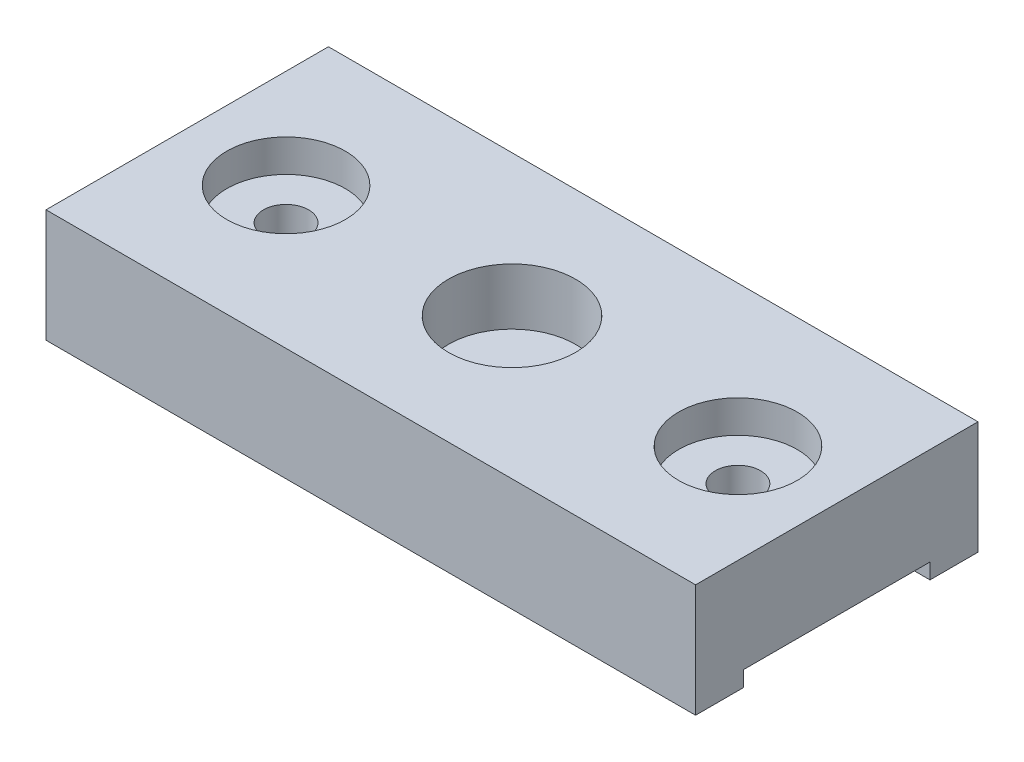
ISO-10303-21;
HEADER;
FILE_DESCRIPTION(('STEP AP214'),'2;1');
FILE_NAME('part.step','',(''),(''),'','','');
FILE_SCHEMA(('AUTOMOTIVE_DESIGN { 1 0 10303 214 1 1 1 1 }'));
ENDSEC;
DATA;
#1=APPLICATION_CONTEXT('core data for automotive mechanical design processes');
#2=APPLICATION_PROTOCOL_DEFINITION('international standard','automotive_design',2000,#1);
#3=PRODUCT_CONTEXT('',#1,'mechanical');
#4=PRODUCT('Part','Part','',(#3));
#5=PRODUCT_RELATED_PRODUCT_CATEGORY('part','',(#4));
#6=PRODUCT_DEFINITION_FORMATION('','',#4);
#7=PRODUCT_DEFINITION_CONTEXT('part definition',#1,'design');
#8=PRODUCT_DEFINITION('design','',#6,#7);
#9=PRODUCT_DEFINITION_SHAPE('','',#8);
#10=(LENGTH_UNIT() NAMED_UNIT(*) SI_UNIT(.MILLI.,.METRE.));
#11=(NAMED_UNIT(*) PLANE_ANGLE_UNIT() SI_UNIT($,.RADIAN.));
#12=(NAMED_UNIT(*) SI_UNIT($,.STERADIAN.) SOLID_ANGLE_UNIT());
#13=UNCERTAINTY_MEASURE_WITH_UNIT(LENGTH_MEASURE(1.E-05),#10,'distance_accuracy_value','');
#14=(GEOMETRIC_REPRESENTATION_CONTEXT(3) GLOBAL_UNCERTAINTY_ASSIGNED_CONTEXT((#13)) GLOBAL_UNIT_ASSIGNED_CONTEXT((#10,
#11,#12)) REPRESENTATION_CONTEXT('',''));
#15=CARTESIAN_POINT('',(0.,0.,0.));
#16=DIRECTION('',(0.,0.,1.));
#17=DIRECTION('',(1.,0.,0.));
#18=AXIS2_PLACEMENT_3D('',#15,#16,#17);
#19=CARTESIAN_POINT('',(0.,0.,0.));
#20=DIRECTION('',(0.,1.,0.));
#21=DIRECTION('',(0.,0.,1.));
#22=AXIS2_PLACEMENT_3D('',#19,#20,#21);
#23=PLANE('',#22);
#24=DIRECTION('',(0.,0.,-1.));
#25=VECTOR('',#24,1.);
#26=CARTESIAN_POINT('',(23.,0.,0.));
#27=LINE('',#26,#25);
#28=CARTESIAN_POINT('',(23.,0.,-6.6));
#29=VERTEX_POINT('',#28);
#30=CARTESIAN_POINT('',(23.,0.,-10.));
#31=VERTEX_POINT('',#30);
#32=EDGE_CURVE('E79',#29,#31,#27,.T.);
#33=ORIENTED_EDGE('',*,*,#32,.F.);
#34=DIRECTION('',(-1.,0.,0.));
#35=VECTOR('',#34,1.);
#36=CARTESIAN_POINT('',(23.001,0.,-6.6));
#37=LINE('',#36,#35);
#38=CARTESIAN_POINT('',(-23.,0.,-6.6));
#39=VERTEX_POINT('',#38);
#40=EDGE_CURVE('E163',#29,#39,#37,.T.);
#41=ORIENTED_EDGE('',*,*,#40,.T.);
#42=DIRECTION('',(0.,0.,-1.));
#43=VECTOR('',#42,1.);
#44=CARTESIAN_POINT('',(-23.,0.,0.));
#45=LINE('',#44,#43);
#46=CARTESIAN_POINT('',(-23.,0.,-10.));
#47=VERTEX_POINT('',#46);
#48=EDGE_CURVE('E130',#39,#47,#45,.T.);
#49=ORIENTED_EDGE('',*,*,#48,.T.);
#50=DIRECTION('',(1.,0.,0.));
#51=VECTOR('',#50,1.);
#52=CARTESIAN_POINT('',(0.,0.,-10.));
#53=LINE('',#52,#51);
#54=EDGE_CURVE('E133',#47,#31,#53,.T.);
#55=ORIENTED_EDGE('',*,*,#54,.T.);
#56=EDGE_LOOP('',(#33,#41,#49,#55));
#57=FACE_BOUND('',#56,.T.);
#58=ADVANCED_FACE('F34',(#57),#23,.F.);
#59=CARTESIAN_POINT('',(0.,8.,-10.));
#60=DIRECTION('',(0.,0.,-1.));
#61=DIRECTION('',(-1.,0.,0.));
#62=AXIS2_PLACEMENT_3D('',#59,#60,#61);
#63=PLANE('',#62);
#64=ORIENTED_EDGE('',*,*,#54,.F.);
#65=DIRECTION('',(0.,-1.,0.));
#66=VECTOR('',#65,1.);
#67=CARTESIAN_POINT('',(-23.,8.,-10.));
#68=LINE('',#67,#66);
#69=CARTESIAN_POINT('',(-23.,8.,-10.));
#70=VERTEX_POINT('',#69);
#71=EDGE_CURVE('E11',#70,#47,#68,.T.);
#72=ORIENTED_EDGE('',*,*,#71,.F.);
#73=DIRECTION('',(1.,0.,0.));
#74=VECTOR('',#73,1.);
#75=CARTESIAN_POINT('',(0.,8.,-10.));
#76=LINE('',#75,#74);
#77=CARTESIAN_POINT('',(23.,8.,-10.));
#78=VERTEX_POINT('',#77);
#79=EDGE_CURVE('E139',#70,#78,#76,.T.);
#80=ORIENTED_EDGE('',*,*,#79,.T.);
#81=DIRECTION('',(0.,-1.,0.));
#82=VECTOR('',#81,1.);
#83=CARTESIAN_POINT('',(23.,8.,-10.));
#84=LINE('',#83,#82);
#85=EDGE_CURVE('E140',#78,#31,#84,.T.);
#86=ORIENTED_EDGE('',*,*,#85,.T.);
#87=EDGE_LOOP('',(#64,#72,#80,#86));
#88=FACE_BOUND('',#87,.T.);
#89=ADVANCED_FACE('F36',(#88),#63,.T.);
#90=CARTESIAN_POINT('',(-23.,8.,0.));
#91=DIRECTION('',(-1.,0.,0.));
#92=DIRECTION('',(0.,0.,1.));
#93=AXIS2_PLACEMENT_3D('',#90,#91,#92);
#94=PLANE('',#93);
#95=DIRECTION('',(0.,-1.,0.));
#96=VECTOR('',#95,1.);
#97=CARTESIAN_POINT('',(-23.,0.,-6.6));
#98=LINE('',#97,#96);
#99=CARTESIAN_POINT('',(-23.,1.1,-6.6));
#100=VERTEX_POINT('',#99);
#101=EDGE_CURVE('E116',#100,#39,#98,.T.);
#102=ORIENTED_EDGE('',*,*,#101,.F.);
#103=DIRECTION('',(0.,0.,-1.));
#104=VECTOR('',#103,1.);
#105=CARTESIAN_POINT('',(-23.,1.1,-6.6));
#106=LINE('',#105,#104);
#107=CARTESIAN_POINT('',(-23.,1.1,6.6));
#108=VERTEX_POINT('',#107);
#109=EDGE_CURVE('E124',#108,#100,#106,.T.);
#110=ORIENTED_EDGE('',*,*,#109,.F.);
#111=DIRECTION('',(0.,1.,0.));
#112=VECTOR('',#111,1.);
#113=CARTESIAN_POINT('',(-23.,1.1,6.6));
#114=LINE('',#113,#112);
#115=CARTESIAN_POINT('',(-23.,0.,6.6));
#116=VERTEX_POINT('',#115);
#117=EDGE_CURVE('E109',#116,#108,#114,.T.);
#118=ORIENTED_EDGE('',*,*,#117,.F.);
#119=CARTESIAN_POINT('',(-23.,0.,10.));
#120=VERTEX_POINT('',#119);
#121=EDGE_CURVE('E122',#120,#116,#45,.T.);
#122=ORIENTED_EDGE('',*,*,#121,.F.);
#123=DIRECTION('',(0.,-1.,0.));
#124=VECTOR('',#123,1.);
#125=CARTESIAN_POINT('',(-23.,8.,10.));
#126=LINE('',#125,#124);
#127=CARTESIAN_POINT('',(-23.,8.,10.));
#128=VERTEX_POINT('',#127);
#129=EDGE_CURVE('E42',#128,#120,#126,.T.);
#130=ORIENTED_EDGE('',*,*,#129,.F.);
#131=DIRECTION('',(0.,0.,-1.));
#132=VECTOR('',#131,1.);
#133=CARTESIAN_POINT('',(-23.,8.,0.));
#134=LINE('',#133,#132);
#135=EDGE_CURVE('E151',#128,#70,#134,.T.);
#136=ORIENTED_EDGE('',*,*,#135,.T.);
#137=ORIENTED_EDGE('',*,*,#71,.T.);
#138=ORIENTED_EDGE('',*,*,#48,.F.);
#139=EDGE_LOOP('',(#102,#110,#118,#122,#130,#136,#137,#138));
#140=FACE_BOUND('',#139,.T.);
#141=ADVANCED_FACE('F121',(#140),#94,.T.);
#142=CARTESIAN_POINT('',(0.,8.,10.));
#143=DIRECTION('',(0.,0.,-1.));
#144=DIRECTION('',(-1.,0.,0.));
#145=AXIS2_PLACEMENT_3D('',#142,#143,#144);
#146=PLANE('',#145);
#147=DIRECTION('',(1.,0.,0.));
#148=VECTOR('',#147,1.);
#149=CARTESIAN_POINT('',(0.,0.,10.));
#150=LINE('',#149,#148);
#151=CARTESIAN_POINT('',(23.,0.,10.));
#152=VERTEX_POINT('',#151);
#153=EDGE_CURVE('E129',#120,#152,#150,.T.);
#154=ORIENTED_EDGE('',*,*,#153,.T.);
#155=DIRECTION('',(0.,-1.,0.));
#156=VECTOR('',#155,1.);
#157=CARTESIAN_POINT('',(23.,8.,10.));
#158=LINE('',#157,#156);
#159=CARTESIAN_POINT('',(23.,8.,10.));
#160=VERTEX_POINT('',#159);
#161=EDGE_CURVE('E142',#160,#152,#158,.T.);
#162=ORIENTED_EDGE('',*,*,#161,.F.);
#163=DIRECTION('',(1.,0.,0.));
#164=VECTOR('',#163,1.);
#165=CARTESIAN_POINT('',(0.,8.,10.));
#166=LINE('',#165,#164);
#167=EDGE_CURVE('E148',#128,#160,#166,.T.);
#168=ORIENTED_EDGE('',*,*,#167,.F.);
#169=ORIENTED_EDGE('',*,*,#129,.T.);
#170=EDGE_LOOP('',(#154,#162,#168,#169));
#171=FACE_BOUND('',#170,.T.);
#172=ADVANCED_FACE('F146',(#171),#146,.F.);
#173=CARTESIAN_POINT('',(23.,8.,0.));
#174=DIRECTION('',(-1.,0.,0.));
#175=DIRECTION('',(0.,0.,1.));
#176=AXIS2_PLACEMENT_3D('',#173,#174,#175);
#177=PLANE('',#176);
#178=DIRECTION('',(0.,0.,1.));
#179=VECTOR('',#178,1.);
#180=CARTESIAN_POINT('',(23.,1.1,-6.6));
#181=LINE('',#180,#179);
#182=CARTESIAN_POINT('',(23.,1.1,-6.6));
#183=VERTEX_POINT('',#182);
#184=CARTESIAN_POINT('',(23.,1.1,6.6));
#185=VERTEX_POINT('',#184);
#186=EDGE_CURVE('E174',#183,#185,#181,.T.);
#187=ORIENTED_EDGE('',*,*,#186,.F.);
#188=DIRECTION('',(0.,1.,0.));
#189=VECTOR('',#188,1.);
#190=CARTESIAN_POINT('',(23.,0.,-6.6));
#191=LINE('',#190,#189);
#192=EDGE_CURVE('E125',#29,#183,#191,.T.);
#193=ORIENTED_EDGE('',*,*,#192,.F.);
#194=ORIENTED_EDGE('',*,*,#32,.T.);
#195=ORIENTED_EDGE('',*,*,#85,.F.);
#196=DIRECTION('',(0.,0.,-1.));
#197=VECTOR('',#196,1.);
#198=CARTESIAN_POINT('',(23.,8.,0.));
#199=LINE('',#198,#197);
#200=EDGE_CURVE('E58',#160,#78,#199,.T.);
#201=ORIENTED_EDGE('',*,*,#200,.F.);
#202=ORIENTED_EDGE('',*,*,#161,.T.);
#203=CARTESIAN_POINT('',(23.,0.,6.6));
#204=VERTEX_POINT('',#203);
#205=EDGE_CURVE('E137',#152,#204,#27,.T.);
#206=ORIENTED_EDGE('',*,*,#205,.T.);
#207=DIRECTION('',(0.,-1.,0.));
#208=VECTOR('',#207,1.);
#209=CARTESIAN_POINT('',(23.,1.1,6.6));
#210=LINE('',#209,#208);
#211=EDGE_CURVE('E49',#185,#204,#210,.T.);
#212=ORIENTED_EDGE('',*,*,#211,.F.);
#213=EDGE_LOOP('',(#187,#193,#194,#195,#201,#202,#206,#212));
#214=FACE_BOUND('',#213,.T.);
#215=ADVANCED_FACE('F207',(#214),#177,.F.);
#216=CARTESIAN_POINT('',(0.,8.,0.));
#217=DIRECTION('',(0.,1.,0.));
#218=DIRECTION('',(0.,0.,1.));
#219=AXIS2_PLACEMENT_3D('',#216,#217,#218);
#220=PLANE('',#219);
#221=CARTESIAN_POINT('',(-16.,8.,0.));
#222=DIRECTION('',(0.,1.,0.));
#223=DIRECTION('',(0.,0.,1.));
#224=AXIS2_PLACEMENT_3D('',#221,#222,#223);
#225=CIRCLE('',#224,4.2);
#226=CARTESIAN_POINT('',(-16.,8.,4.2));
#227=VERTEX_POINT('',#226);
#228=EDGE_CURVE('E198',#227,#227,#225,.T.);
#229=ORIENTED_EDGE('',*,*,#228,.F.);
#230=EDGE_LOOP('',(#229));
#231=FACE_BOUND('',#230,.T.);
#232=CARTESIAN_POINT('',(16.,8.,0.));
#233=DIRECTION('',(0.,1.,0.));
#234=DIRECTION('',(0.,0.,1.));
#235=AXIS2_PLACEMENT_3D('',#232,#233,#234);
#236=CIRCLE('',#235,4.2);
#237=CARTESIAN_POINT('',(16.,8.,4.2));
#238=VERTEX_POINT('',#237);
#239=EDGE_CURVE('E186',#238,#238,#236,.T.);
#240=ORIENTED_EDGE('',*,*,#239,.F.);
#241=EDGE_LOOP('',(#240));
#242=FACE_BOUND('',#241,.T.);
#243=CARTESIAN_POINT('',(0.,8.,0.));
#244=DIRECTION('',(0.,1.,0.));
#245=DIRECTION('',(0.,0.,1.));
#246=AXIS2_PLACEMENT_3D('',#243,#244,#245);
#247=CIRCLE('',#246,4.5);
#248=CARTESIAN_POINT('',(0.,8.,4.5));
#249=VERTEX_POINT('',#248);
#250=EDGE_CURVE('E157',#249,#249,#247,.T.);
#251=ORIENTED_EDGE('',*,*,#250,.F.);
#252=EDGE_LOOP('',(#251));
#253=FACE_BOUND('',#252,.T.);
#254=ORIENTED_EDGE('',*,*,#79,.F.);
#255=ORIENTED_EDGE('',*,*,#135,.F.);
#256=ORIENTED_EDGE('',*,*,#167,.T.);
#257=ORIENTED_EDGE('',*,*,#200,.T.);
#258=EDGE_LOOP('',(#254,#255,#256,#257));
#259=FACE_BOUND('',#258,.T.);
#260=ADVANCED_FACE('F204',(#231,#242,#253,#259),#220,.T.);
#261=ORIENTED_EDGE('',*,*,#121,.T.);
#262=DIRECTION('',(-1.,0.,0.));
#263=VECTOR('',#262,1.);
#264=CARTESIAN_POINT('',(23.001,0.,6.6));
#265=LINE('',#264,#263);
#266=EDGE_CURVE('E106',#204,#116,#265,.T.);
#267=ORIENTED_EDGE('',*,*,#266,.F.);
#268=ORIENTED_EDGE('',*,*,#205,.F.);
#269=ORIENTED_EDGE('',*,*,#153,.F.);
#270=EDGE_LOOP('',(#261,#267,#268,#269));
#271=FACE_BOUND('',#270,.T.);
#272=ADVANCED_FACE('F128',(#271),#23,.F.);
#273=CARTESIAN_POINT('',(0.,4.,0.));
#274=DIRECTION('',(0.,1.,0.));
#275=DIRECTION('',(0.,0.,1.));
#276=AXIS2_PLACEMENT_3D('',#273,#274,#275);
#277=CYLINDRICAL_SURFACE('',#276,4.5);
#278=CARTESIAN_POINT('',(0.,4.,0.));
#279=DIRECTION('',(0.,1.,0.));
#280=DIRECTION('',(0.,0.,1.));
#281=AXIS2_PLACEMENT_3D('',#278,#279,#280);
#282=CIRCLE('',#281,4.5);
#283=CARTESIAN_POINT('',(0.,4.,4.5));
#284=VERTEX_POINT('',#283);
#285=EDGE_CURVE('E160',#284,#284,#282,.T.);
#286=ORIENTED_EDGE('',*,*,#285,.F.);
#287=EDGE_LOOP('',(#286));
#288=FACE_BOUND('',#287,.T.);
#289=ORIENTED_EDGE('',*,*,#250,.T.);
#290=EDGE_LOOP('',(#289));
#291=FACE_BOUND('',#290,.T.);
#292=ADVANCED_FACE('F231',(#288,#291),#277,.F.);
#293=CARTESIAN_POINT('',(0.,4.,0.));
#294=DIRECTION('',(0.,1.,0.));
#295=DIRECTION('',(0.,0.,1.));
#296=AXIS2_PLACEMENT_3D('',#293,#294,#295);
#297=PLANE('',#296);
#298=ORIENTED_EDGE('',*,*,#285,.T.);
#299=EDGE_LOOP('',(#298));
#300=FACE_BOUND('',#299,.T.);
#301=ADVANCED_FACE('F235',(#300),#297,.T.);
#302=CARTESIAN_POINT('',(23.001,0.,-6.6));
#303=DIRECTION('',(0.,0.,-1.));
#304=DIRECTION('',(-1.,0.,0.));
#305=AXIS2_PLACEMENT_3D('',#302,#303,#304);
#306=PLANE('',#305);
#307=ORIENTED_EDGE('',*,*,#192,.T.);
#308=DIRECTION('',(-1.,0.,0.));
#309=VECTOR('',#308,1.);
#310=CARTESIAN_POINT('',(23.001,1.1,-6.6));
#311=LINE('',#310,#309);
#312=EDGE_CURVE('E166',#183,#100,#311,.T.);
#313=ORIENTED_EDGE('',*,*,#312,.T.);
#314=ORIENTED_EDGE('',*,*,#101,.T.);
#315=ORIENTED_EDGE('',*,*,#40,.F.);
#316=EDGE_LOOP('',(#307,#313,#314,#315));
#317=FACE_BOUND('',#316,.T.);
#318=ADVANCED_FACE('F215',(#317),#306,.F.);
#319=CARTESIAN_POINT('',(23.001,1.1,-6.6));
#320=DIRECTION('',(0.,1.,0.));
#321=DIRECTION('',(0.,0.,1.));
#322=AXIS2_PLACEMENT_3D('',#319,#320,#321);
#323=PLANE('',#322);
#324=CARTESIAN_POINT('',(-16.,1.1,0.));
#325=DIRECTION('',(0.,1.,0.));
#326=DIRECTION('',(0.,0.,1.));
#327=AXIS2_PLACEMENT_3D('',#324,#325,#326);
#328=CIRCLE('',#327,1.6);
#329=CARTESIAN_POINT('',(-16.,1.1,1.6));
#330=VERTEX_POINT('',#329);
#331=EDGE_CURVE('E189',#330,#330,#328,.T.);
#332=ORIENTED_EDGE('',*,*,#331,.T.);
#333=EDGE_LOOP('',(#332));
#334=FACE_BOUND('',#333,.T.);
#335=CARTESIAN_POINT('',(16.,1.1,0.));
#336=DIRECTION('',(0.,1.,0.));
#337=DIRECTION('',(0.,0.,1.));
#338=AXIS2_PLACEMENT_3D('',#335,#336,#337);
#339=CIRCLE('',#338,1.6);
#340=CARTESIAN_POINT('',(16.,1.1,1.6));
#341=VERTEX_POINT('',#340);
#342=EDGE_CURVE('E177',#341,#341,#339,.T.);
#343=ORIENTED_EDGE('',*,*,#342,.T.);
#344=EDGE_LOOP('',(#343));
#345=FACE_BOUND('',#344,.T.);
#346=ORIENTED_EDGE('',*,*,#186,.T.);
#347=DIRECTION('',(-1.,0.,0.));
#348=VECTOR('',#347,1.);
#349=CARTESIAN_POINT('',(23.001,1.1,6.6));
#350=LINE('',#349,#348);
#351=EDGE_CURVE('E115',#185,#108,#350,.T.);
#352=ORIENTED_EDGE('',*,*,#351,.T.);
#353=ORIENTED_EDGE('',*,*,#109,.T.);
#354=ORIENTED_EDGE('',*,*,#312,.F.);
#355=EDGE_LOOP('',(#346,#352,#353,#354));
#356=FACE_BOUND('',#355,.T.);
#357=ADVANCED_FACE('F218',(#334,#345,#356),#323,.F.);
#358=CARTESIAN_POINT('',(23.001,1.1,6.6));
#359=DIRECTION('',(0.,0.,1.));
#360=DIRECTION('',(1.,0.,0.));
#361=AXIS2_PLACEMENT_3D('',#358,#359,#360);
#362=PLANE('',#361);
#363=ORIENTED_EDGE('',*,*,#211,.T.);
#364=ORIENTED_EDGE('',*,*,#266,.T.);
#365=ORIENTED_EDGE('',*,*,#117,.T.);
#366=ORIENTED_EDGE('',*,*,#351,.F.);
#367=EDGE_LOOP('',(#363,#364,#365,#366));
#368=FACE_BOUND('',#367,.T.);
#369=ADVANCED_FACE('F108',(#368),#362,.F.);
#370=CARTESIAN_POINT('',(16.,8.,0.));
#371=DIRECTION('',(0.,1.,0.));
#372=DIRECTION('',(0.,0.,1.));
#373=AXIS2_PLACEMENT_3D('',#370,#371,#372);
#374=CYLINDRICAL_SURFACE('',#373,1.6);
#375=ORIENTED_EDGE('',*,*,#342,.F.);
#376=EDGE_LOOP('',(#375));
#377=FACE_BOUND('',#376,.T.);
#378=CARTESIAN_POINT('',(16.,5.7,0.));
#379=DIRECTION('',(0.,1.,0.));
#380=DIRECTION('',(0.,0.,1.));
#381=AXIS2_PLACEMENT_3D('',#378,#379,#380);
#382=CIRCLE('',#381,1.6);
#383=CARTESIAN_POINT('',(16.,5.7,1.6));
#384=VERTEX_POINT('',#383);
#385=EDGE_CURVE('E180',#384,#384,#382,.T.);
#386=ORIENTED_EDGE('',*,*,#385,.T.);
#387=EDGE_LOOP('',(#386));
#388=FACE_BOUND('',#387,.T.);
#389=ADVANCED_FACE('F248',(#377,#388),#374,.F.);
#390=CARTESIAN_POINT('',(17.6,5.7,0.));
#391=DIRECTION('',(0.,-1.,0.));
#392=DIRECTION('',(0.,0.,-1.));
#393=AXIS2_PLACEMENT_3D('',#390,#391,#392);
#394=PLANE('',#393);
#395=ORIENTED_EDGE('',*,*,#385,.F.);
#396=EDGE_LOOP('',(#395));
#397=FACE_BOUND('',#396,.T.);
#398=CARTESIAN_POINT('',(16.,5.7,0.));
#399=DIRECTION('',(0.,1.,0.));
#400=DIRECTION('',(0.,0.,1.));
#401=AXIS2_PLACEMENT_3D('',#398,#399,#400);
#402=CIRCLE('',#401,4.2);
#403=CARTESIAN_POINT('',(16.,5.7,4.2));
#404=VERTEX_POINT('',#403);
#405=EDGE_CURVE('E183',#404,#404,#402,.T.);
#406=ORIENTED_EDGE('',*,*,#405,.T.);
#407=EDGE_LOOP('',(#406));
#408=FACE_BOUND('',#407,.T.);
#409=ADVANCED_FACE('F256',(#397,#408),#394,.F.);
#410=CARTESIAN_POINT('',(16.,8.,0.));
#411=DIRECTION('',(0.,1.,0.));
#412=DIRECTION('',(0.,0.,1.));
#413=AXIS2_PLACEMENT_3D('',#410,#411,#412);
#414=CYLINDRICAL_SURFACE('',#413,4.2);
#415=ORIENTED_EDGE('',*,*,#405,.F.);
#416=EDGE_LOOP('',(#415));
#417=FACE_BOUND('',#416,.T.);
#418=ORIENTED_EDGE('',*,*,#239,.T.);
#419=EDGE_LOOP('',(#418));
#420=FACE_BOUND('',#419,.T.);
#421=ADVANCED_FACE('F260',(#417,#420),#414,.F.);
#422=CARTESIAN_POINT('',(-16.,8.,0.));
#423=DIRECTION('',(0.,1.,0.));
#424=DIRECTION('',(0.,0.,1.));
#425=AXIS2_PLACEMENT_3D('',#422,#423,#424);
#426=CYLINDRICAL_SURFACE('',#425,1.6);
#427=ORIENTED_EDGE('',*,*,#331,.F.);
#428=EDGE_LOOP('',(#427));
#429=FACE_BOUND('',#428,.T.);
#430=CARTESIAN_POINT('',(-16.,5.7,0.));
#431=DIRECTION('',(0.,1.,0.));
#432=DIRECTION('',(0.,0.,1.));
#433=AXIS2_PLACEMENT_3D('',#430,#431,#432);
#434=CIRCLE('',#433,1.6);
#435=CARTESIAN_POINT('',(-16.,5.7,1.6));
#436=VERTEX_POINT('',#435);
#437=EDGE_CURVE('E192',#436,#436,#434,.T.);
#438=ORIENTED_EDGE('',*,*,#437,.T.);
#439=EDGE_LOOP('',(#438));
#440=FACE_BOUND('',#439,.T.);
#441=ADVANCED_FACE('F264',(#429,#440),#426,.F.);
#442=CARTESIAN_POINT('',(-14.4,5.7,0.));
#443=DIRECTION('',(0.,-1.,0.));
#444=DIRECTION('',(0.,0.,-1.));
#445=AXIS2_PLACEMENT_3D('',#442,#443,#444);
#446=PLANE('',#445);
#447=ORIENTED_EDGE('',*,*,#437,.F.);
#448=EDGE_LOOP('',(#447));
#449=FACE_BOUND('',#448,.T.);
#450=CARTESIAN_POINT('',(-16.,5.7,0.));
#451=DIRECTION('',(0.,1.,0.));
#452=DIRECTION('',(0.,0.,1.));
#453=AXIS2_PLACEMENT_3D('',#450,#451,#452);
#454=CIRCLE('',#453,4.2);
#455=CARTESIAN_POINT('',(-16.,5.7,4.2));
#456=VERTEX_POINT('',#455);
#457=EDGE_CURVE('E195',#456,#456,#454,.T.);
#458=ORIENTED_EDGE('',*,*,#457,.T.);
#459=EDGE_LOOP('',(#458));
#460=FACE_BOUND('',#459,.T.);
#461=ADVANCED_FACE('F268',(#449,#460),#446,.F.);
#462=CARTESIAN_POINT('',(-16.,8.,0.));
#463=DIRECTION('',(0.,1.,0.));
#464=DIRECTION('',(0.,0.,1.));
#465=AXIS2_PLACEMENT_3D('',#462,#463,#464);
#466=CYLINDRICAL_SURFACE('',#465,4.2);
#467=ORIENTED_EDGE('',*,*,#457,.F.);
#468=EDGE_LOOP('',(#467));
#469=FACE_BOUND('',#468,.T.);
#470=ORIENTED_EDGE('',*,*,#228,.T.);
#471=EDGE_LOOP('',(#470));
#472=FACE_BOUND('',#471,.T.);
#473=ADVANCED_FACE('F202',(#469,#472),#466,.F.);
#474=CLOSED_SHELL('',(#58,#89,#141,#172,#215,#260,#272,#292,#301,#318,#357,#369,#389,#409,#421,
#441,#461,#473));
#475=MANIFOLD_SOLID_BREP('B2',#474);
#476=ADVANCED_BREP_SHAPE_REPRESENTATION('',(#18,#475),#14);
#477=SHAPE_DEFINITION_REPRESENTATION(#9,#476);
ENDSEC;
END-ISO-10303-21;
